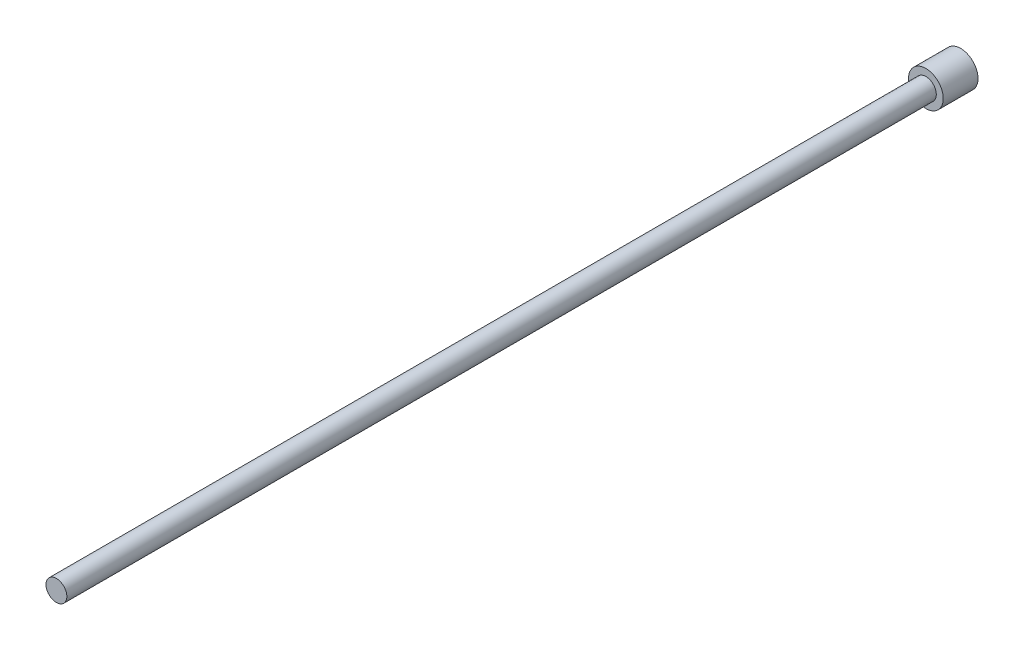
ISO-10303-21;
HEADER;
FILE_DESCRIPTION(('STEP AP214'),'2;1');
FILE_NAME('part.step','',(''),(''),'','','');
FILE_SCHEMA(('AUTOMOTIVE_DESIGN { 1 0 10303 214 1 1 1 1 }'));
ENDSEC;
DATA;
#1=APPLICATION_CONTEXT('core data for automotive mechanical design processes');
#2=APPLICATION_PROTOCOL_DEFINITION('international standard','automotive_design',2000,#1);
#3=PRODUCT_CONTEXT('',#1,'mechanical');
#4=PRODUCT('Part','Part','',(#3));
#5=PRODUCT_RELATED_PRODUCT_CATEGORY('part','',(#4));
#6=PRODUCT_DEFINITION_FORMATION('','',#4);
#7=PRODUCT_DEFINITION_CONTEXT('part definition',#1,'design');
#8=PRODUCT_DEFINITION('design','',#6,#7);
#9=PRODUCT_DEFINITION_SHAPE('','',#8);
#10=(LENGTH_UNIT() NAMED_UNIT(*) SI_UNIT(.MILLI.,.METRE.));
#11=(NAMED_UNIT(*) PLANE_ANGLE_UNIT() SI_UNIT($,.RADIAN.));
#12=(NAMED_UNIT(*) SI_UNIT($,.STERADIAN.) SOLID_ANGLE_UNIT());
#13=UNCERTAINTY_MEASURE_WITH_UNIT(LENGTH_MEASURE(1.E-05),#10,'distance_accuracy_value','');
#14=(GEOMETRIC_REPRESENTATION_CONTEXT(3) GLOBAL_UNCERTAINTY_ASSIGNED_CONTEXT((#13)) GLOBAL_UNIT_ASSIGNED_CONTEXT((#10,
#11,#12)) REPRESENTATION_CONTEXT('',''));
#15=CARTESIAN_POINT('',(0.,0.,0.));
#16=DIRECTION('',(0.,0.,1.));
#17=DIRECTION('',(1.,0.,0.));
#18=AXIS2_PLACEMENT_3D('',#15,#16,#17);
#19=CARTESIAN_POINT('',(0.,0.,50.));
#20=DIRECTION('',(0.,0.,-1.));
#21=DIRECTION('',(-1.,0.,0.));
#22=AXIS2_PLACEMENT_3D('',#19,#20,#21);
#23=CYLINDRICAL_SURFACE('',#22,0.6);
#24=CARTESIAN_POINT('',(0.,0.,50.));
#25=DIRECTION('',(0.,0.,1.));
#26=DIRECTION('',(1.,0.,0.));
#27=AXIS2_PLACEMENT_3D('',#24,#25,#26);
#28=CIRCLE('',#27,0.6);
#29=CARTESIAN_POINT('',(0.6,0.,50.));
#30=VERTEX_POINT('',#29);
#31=EDGE_CURVE('E10',#30,#30,#28,.T.);
#32=ORIENTED_EDGE('',*,*,#31,.F.);
#33=EDGE_LOOP('',(#32));
#34=FACE_BOUND('',#33,.T.);
#35=CARTESIAN_POINT('',(0.,0.,0.));
#36=DIRECTION('',(0.,0.,1.));
#37=DIRECTION('',(1.,0.,0.));
#38=AXIS2_PLACEMENT_3D('',#35,#36,#37);
#39=CIRCLE('',#38,0.6);
#40=CARTESIAN_POINT('',(0.6,0.,0.));
#41=VERTEX_POINT('',#40);
#42=EDGE_CURVE('E46',#41,#41,#39,.T.);
#43=ORIENTED_EDGE('',*,*,#42,.T.);
#44=EDGE_LOOP('',(#43));
#45=FACE_BOUND('',#44,.T.);
#46=ADVANCED_FACE('F43',(#34,#45),#23,.T.);
#47=CARTESIAN_POINT('',(0.,0.,50.));
#48=DIRECTION('',(0.,0.,1.));
#49=DIRECTION('',(1.,0.,0.));
#50=AXIS2_PLACEMENT_3D('',#47,#48,#49);
#51=PLANE('',#50);
#52=ORIENTED_EDGE('',*,*,#31,.T.);
#53=EDGE_LOOP('',(#52));
#54=FACE_BOUND('',#53,.T.);
#55=ADVANCED_FACE('F69',(#54),#51,.T.);
#56=CARTESIAN_POINT('',(0.,0.,-2.));
#57=DIRECTION('',(0.,0.,1.));
#58=DIRECTION('',(1.,0.,0.));
#59=AXIS2_PLACEMENT_3D('',#56,#57,#58);
#60=CYLINDRICAL_SURFACE('',#59,1.);
#61=CARTESIAN_POINT('',(0.,0.,-2.));
#62=DIRECTION('',(0.,0.,-1.));
#63=DIRECTION('',(-1.,0.,0.));
#64=AXIS2_PLACEMENT_3D('',#61,#62,#63);
#65=CIRCLE('',#64,1.);
#66=CARTESIAN_POINT('',(-1.,0.,-2.));
#67=VERTEX_POINT('',#66);
#68=EDGE_CURVE('E54',#67,#67,#65,.T.);
#69=ORIENTED_EDGE('',*,*,#68,.F.);
#70=EDGE_LOOP('',(#69));
#71=FACE_BOUND('',#70,.T.);
#72=CARTESIAN_POINT('',(0.,0.,0.));
#73=DIRECTION('',(0.,0.,-1.));
#74=DIRECTION('',(-1.,0.,0.));
#75=AXIS2_PLACEMENT_3D('',#72,#73,#74);
#76=CIRCLE('',#75,1.);
#77=CARTESIAN_POINT('',(-1.,0.,0.));
#78=VERTEX_POINT('',#77);
#79=EDGE_CURVE('E60',#78,#78,#76,.T.);
#80=ORIENTED_EDGE('',*,*,#79,.T.);
#81=EDGE_LOOP('',(#80));
#82=FACE_BOUND('',#81,.T.);
#83=ADVANCED_FACE('F70',(#71,#82),#60,.T.);
#84=CARTESIAN_POINT('',(0.,0.,-2.));
#85=DIRECTION('',(0.,0.,-1.));
#86=DIRECTION('',(-1.,0.,0.));
#87=AXIS2_PLACEMENT_3D('',#84,#85,#86);
#88=PLANE('',#87);
#89=ORIENTED_EDGE('',*,*,#68,.T.);
#90=EDGE_LOOP('',(#89));
#91=FACE_BOUND('',#90,.T.);
#92=ADVANCED_FACE('F63',(#91),#88,.T.);
#93=CARTESIAN_POINT('',(0.,0.,0.));
#94=DIRECTION('',(0.,0.,-1.));
#95=DIRECTION('',(-1.,0.,0.));
#96=AXIS2_PLACEMENT_3D('',#93,#94,#95);
#97=PLANE('',#96);
#98=ORIENTED_EDGE('',*,*,#42,.F.);
#99=EDGE_LOOP('',(#98));
#100=FACE_BOUND('',#99,.T.);
#101=ORIENTED_EDGE('',*,*,#79,.F.);
#102=EDGE_LOOP('',(#101));
#103=FACE_BOUND('',#102,.T.);
#104=ADVANCED_FACE('F74',(#100,#103),#97,.F.);
#105=CLOSED_SHELL('',(#46,#55,#83,#92,#104));
#106=MANIFOLD_SOLID_BREP('B2',#105);
#107=ADVANCED_BREP_SHAPE_REPRESENTATION('',(#18,#106),#14);
#108=SHAPE_DEFINITION_REPRESENTATION(#9,#107);
ENDSEC;
END-ISO-10303-21;
